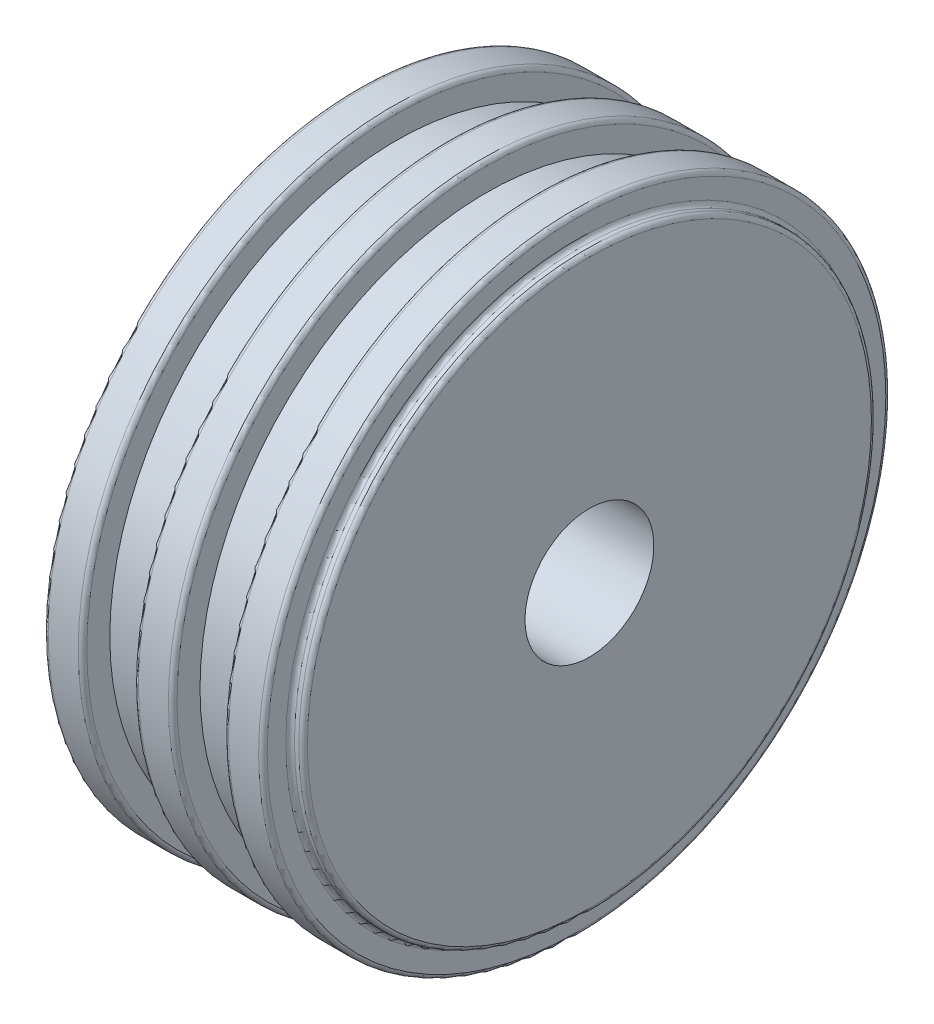
ISO-10303-21;
HEADER;
FILE_DESCRIPTION(('STEP AP214'),'2;1');
FILE_NAME('part.step','',(''),(''),'','','');
FILE_SCHEMA(('AUTOMOTIVE_DESIGN { 1 0 10303 214 1 1 1 1 }'));
ENDSEC;
DATA;
#1=APPLICATION_CONTEXT('core data for automotive mechanical design processes');
#2=APPLICATION_PROTOCOL_DEFINITION('international standard','automotive_design',2000,#1);
#3=PRODUCT_CONTEXT('',#1,'mechanical');
#4=PRODUCT('Part','Part','',(#3));
#5=PRODUCT_RELATED_PRODUCT_CATEGORY('part','',(#4));
#6=PRODUCT_DEFINITION_FORMATION('','',#4);
#7=PRODUCT_DEFINITION_CONTEXT('part definition',#1,'design');
#8=PRODUCT_DEFINITION('design','',#6,#7);
#9=PRODUCT_DEFINITION_SHAPE('','',#8);
#10=(LENGTH_UNIT() NAMED_UNIT(*) SI_UNIT(.MILLI.,.METRE.));
#11=(NAMED_UNIT(*) PLANE_ANGLE_UNIT() SI_UNIT($,.RADIAN.));
#12=(NAMED_UNIT(*) SI_UNIT($,.STERADIAN.) SOLID_ANGLE_UNIT());
#13=UNCERTAINTY_MEASURE_WITH_UNIT(LENGTH_MEASURE(1.E-05),#10,'distance_accuracy_value','');
#14=(GEOMETRIC_REPRESENTATION_CONTEXT(3) GLOBAL_UNCERTAINTY_ASSIGNED_CONTEXT((#13)) GLOBAL_UNIT_ASSIGNED_CONTEXT((#10,
#11,#12)) REPRESENTATION_CONTEXT('',''));
#15=CARTESIAN_POINT('',(0.,0.,0.));
#16=DIRECTION('',(0.,0.,1.));
#17=DIRECTION('',(1.,0.,0.));
#18=AXIS2_PLACEMENT_3D('',#15,#16,#17);
#19=CARTESIAN_POINT('',(0.,66.675,0.));
#20=DIRECTION('',(-1.,0.,0.));
#21=DIRECTION('',(0.,0.,1.));
#22=AXIS2_PLACEMENT_3D('',#19,#20,#21);
#23=PLANE('',#22);
#24=CARTESIAN_POINT('',(0.,0.,0.));
#25=DIRECTION('',(-1.,0.,0.));
#26=DIRECTION('',(0.,0.,1.));
#27=AXIS2_PLACEMENT_3D('',#24,#25,#26);
#28=CIRCLE('',#27,65.675);
#29=CARTESIAN_POINT('',(0.,0.,65.675));
#30=VERTEX_POINT('',#29);
#31=EDGE_CURVE('E50',#30,#30,#28,.F.);
#32=ORIENTED_EDGE('',*,*,#31,.T.);
#33=EDGE_LOOP('',(#32));
#34=FACE_BOUND('',#33,.T.);
#35=CARTESIAN_POINT('',(0.,0.,0.));
#36=DIRECTION('',(-1.,0.,0.));
#37=DIRECTION('',(0.,0.,1.));
#38=AXIS2_PLACEMENT_3D('',#35,#36,#37);
#39=CIRCLE('',#38,15.);
#40=CARTESIAN_POINT('',(0.,0.,15.));
#41=VERTEX_POINT('',#40);
#42=EDGE_CURVE('E118',#41,#41,#39,.T.);
#43=ORIENTED_EDGE('',*,*,#42,.T.);
#44=EDGE_LOOP('',(#43));
#45=FACE_BOUND('',#44,.T.);
#46=ADVANCED_FACE('F35',(#34,#45),#23,.F.);
#47=CARTESIAN_POINT('',(0.,0.,0.));
#48=DIRECTION('',(-1.,0.,0.));
#49=DIRECTION('',(0.,0.,1.));
#50=AXIS2_PLACEMENT_3D('',#47,#48,#49);
#51=CYLINDRICAL_SURFACE('',#50,66.675);
#52=CARTESIAN_POINT('',(-1.,0.,0.));
#53=DIRECTION('',(-1.,0.,0.));
#54=DIRECTION('',(0.,0.,1.));
#55=AXIS2_PLACEMENT_3D('',#52,#53,#54);
#56=CIRCLE('',#55,66.675);
#57=CARTESIAN_POINT('',(-1.,0.,66.675));
#58=VERTEX_POINT('',#57);
#59=EDGE_CURVE('E55',#58,#58,#56,.T.);
#60=ORIENTED_EDGE('',*,*,#59,.T.);
#61=EDGE_LOOP('',(#60));
#62=FACE_BOUND('',#61,.T.);
#63=CARTESIAN_POINT('',(-2.00000000000001,0.,0.));
#64=DIRECTION('',(-1.,0.,0.));
#65=DIRECTION('',(0.,0.,1.));
#66=AXIS2_PLACEMENT_3D('',#63,#64,#65);
#67=CIRCLE('',#66,66.675);
#68=CARTESIAN_POINT('',(-2.00000000000001,0.,66.675));
#69=VERTEX_POINT('',#68);
#70=EDGE_CURVE('E58',#69,#69,#67,.F.);
#71=ORIENTED_EDGE('',*,*,#70,.T.);
#72=EDGE_LOOP('',(#71));
#73=FACE_BOUND('',#72,.T.);
#74=ADVANCED_FACE('F140',(#62,#73),#51,.T.);
#75=CARTESIAN_POINT('',(-3.00000000000001,73.025,0.));
#76=DIRECTION('',(-1.,0.,0.));
#77=DIRECTION('',(0.,0.,1.));
#78=AXIS2_PLACEMENT_3D('',#75,#76,#77);
#79=PLANE('',#78);
#80=CARTESIAN_POINT('',(-3.00000000000001,0.,0.));
#81=DIRECTION('',(-1.,0.,0.));
#82=DIRECTION('',(0.,0.,1.));
#83=AXIS2_PLACEMENT_3D('',#80,#81,#82);
#84=CIRCLE('',#83,72.025);
#85=CARTESIAN_POINT('',(-3.00000000000001,0.,72.025));
#86=VERTEX_POINT('',#85);
#87=EDGE_CURVE('E91',#86,#86,#84,.F.);
#88=ORIENTED_EDGE('',*,*,#87,.T.);
#89=EDGE_LOOP('',(#88));
#90=FACE_BOUND('',#89,.T.);
#91=CARTESIAN_POINT('',(-3.00000000000001,0.,0.));
#92=DIRECTION('',(-1.,0.,0.));
#93=DIRECTION('',(0.,0.,1.));
#94=AXIS2_PLACEMENT_3D('',#91,#92,#93);
#95=CIRCLE('',#94,67.675);
#96=CARTESIAN_POINT('',(-3.00000000000001,0.,67.675));
#97=VERTEX_POINT('',#96);
#98=EDGE_CURVE('E94',#97,#97,#95,.T.);
#99=ORIENTED_EDGE('',*,*,#98,.T.);
#100=EDGE_LOOP('',(#99));
#101=FACE_BOUND('',#100,.T.);
#102=ADVANCED_FACE('F146',(#90,#101),#79,.F.);
#103=CARTESIAN_POINT('',(0.,0.,0.));
#104=DIRECTION('',(-1.,0.,0.));
#105=DIRECTION('',(0.,0.,1.));
#106=AXIS2_PLACEMENT_3D('',#103,#104,#105);
#107=CYLINDRICAL_SURFACE('',#106,73.025);
#108=CARTESIAN_POINT('',(-4.00000000000001,0.,0.));
#109=DIRECTION('',(-1.,0.,0.));
#110=DIRECTION('',(0.,0.,1.));
#111=AXIS2_PLACEMENT_3D('',#108,#109,#110);
#112=CIRCLE('',#111,73.025);
#113=CARTESIAN_POINT('',(-4.00000000000001,0.,73.025));
#114=VERTEX_POINT('',#113);
#115=EDGE_CURVE('E97',#114,#114,#112,.T.);
#116=ORIENTED_EDGE('',*,*,#115,.T.);
#117=EDGE_LOOP('',(#116));
#118=FACE_BOUND('',#117,.T.);
#119=CARTESIAN_POINT('',(-11.,0.,0.));
#120=DIRECTION('',(1.,0.,0.));
#121=DIRECTION('',(0.,0.,-1.));
#122=AXIS2_PLACEMENT_3D('',#119,#120,#121);
#123=CIRCLE('',#122,73.025);
#124=CARTESIAN_POINT('',(-11.,0.,-73.025));
#125=VERTEX_POINT('',#124);
#126=EDGE_CURVE('E100',#125,#125,#123,.T.);
#127=ORIENTED_EDGE('',*,*,#126,.T.);
#128=EDGE_LOOP('',(#127));
#129=FACE_BOUND('',#128,.T.);
#130=ADVANCED_FACE('F228',(#118,#129),#107,.T.);
#131=CARTESIAN_POINT('',(-12.,73.025,0.));
#132=DIRECTION('',(1.,0.,0.));
#133=DIRECTION('',(0.,0.,-1.));
#134=AXIS2_PLACEMENT_3D('',#131,#132,#133);
#135=PLANE('',#134);
#136=CARTESIAN_POINT('',(-12.,0.,0.));
#137=DIRECTION('',(1.,0.,0.));
#138=DIRECTION('',(0.,0.,-1.));
#139=AXIS2_PLACEMENT_3D('',#136,#137,#138);
#140=CIRCLE('',#139,72.025);
#141=CARTESIAN_POINT('',(-12.,0.,-72.025));
#142=VERTEX_POINT('',#141);
#143=EDGE_CURVE('E88',#142,#142,#140,.F.);
#144=ORIENTED_EDGE('',*,*,#143,.T.);
#145=EDGE_LOOP('',(#144));
#146=FACE_BOUND('',#145,.T.);
#147=CARTESIAN_POINT('',(-12.,0.,0.));
#148=DIRECTION('',(-1.,0.,0.));
#149=DIRECTION('',(0.,0.,1.));
#150=AXIS2_PLACEMENT_3D('',#147,#148,#149);
#151=CIRCLE('',#150,66.675);
#152=CARTESIAN_POINT('',(-12.,0.,66.675));
#153=VERTEX_POINT('',#152);
#154=EDGE_CURVE('E103',#153,#153,#151,.T.);
#155=ORIENTED_EDGE('',*,*,#154,.F.);
#156=EDGE_LOOP('',(#155));
#157=FACE_BOUND('',#156,.T.);
#158=ADVANCED_FACE('F224',(#146,#157),#135,.F.);
#159=CARTESIAN_POINT('',(0.,0.,0.));
#160=DIRECTION('',(-1.,0.,0.));
#161=DIRECTION('',(0.,0.,1.));
#162=AXIS2_PLACEMENT_3D('',#159,#160,#161);
#163=CYLINDRICAL_SURFACE('',#162,66.675);
#164=CARTESIAN_POINT('',(-24.,0.,0.));
#165=DIRECTION('',(-1.,0.,0.));
#166=DIRECTION('',(0.,0.,1.));
#167=AXIS2_PLACEMENT_3D('',#164,#165,#166);
#168=CIRCLE('',#167,66.675);
#169=CARTESIAN_POINT('',(-24.,0.,66.675));
#170=VERTEX_POINT('',#169);
#171=EDGE_CURVE('E106',#170,#170,#168,.T.);
#172=ORIENTED_EDGE('',*,*,#171,.F.);
#173=EDGE_LOOP('',(#172));
#174=FACE_BOUND('',#173,.T.);
#175=ORIENTED_EDGE('',*,*,#154,.T.);
#176=EDGE_LOOP('',(#175));
#177=FACE_BOUND('',#176,.T.);
#178=ADVANCED_FACE('F220',(#174,#177),#163,.T.);
#179=CARTESIAN_POINT('',(-24.,66.675,0.));
#180=DIRECTION('',(-1.,0.,0.));
#181=DIRECTION('',(0.,0.,1.));
#182=AXIS2_PLACEMENT_3D('',#179,#180,#181);
#183=PLANE('',#182);
#184=CARTESIAN_POINT('',(-24.,0.,0.));
#185=DIRECTION('',(-1.,0.,0.));
#186=DIRECTION('',(0.,0.,1.));
#187=AXIS2_PLACEMENT_3D('',#184,#185,#186);
#188=CIRCLE('',#187,72.025);
#189=CARTESIAN_POINT('',(-24.,0.,72.025));
#190=VERTEX_POINT('',#189);
#191=EDGE_CURVE('E79',#190,#190,#188,.F.);
#192=ORIENTED_EDGE('',*,*,#191,.T.);
#193=EDGE_LOOP('',(#192));
#194=FACE_BOUND('',#193,.T.);
#195=ORIENTED_EDGE('',*,*,#171,.T.);
#196=EDGE_LOOP('',(#195));
#197=FACE_BOUND('',#196,.T.);
#198=ADVANCED_FACE('F216',(#194,#197),#183,.F.);
#199=CARTESIAN_POINT('',(0.,0.,0.));
#200=DIRECTION('',(-1.,0.,0.));
#201=DIRECTION('',(0.,0.,1.));
#202=AXIS2_PLACEMENT_3D('',#199,#200,#201);
#203=CYLINDRICAL_SURFACE('',#202,73.025);
#204=CARTESIAN_POINT('',(-25.,0.,0.));
#205=DIRECTION('',(-1.,0.,0.));
#206=DIRECTION('',(0.,0.,1.));
#207=AXIS2_PLACEMENT_3D('',#204,#205,#206);
#208=CIRCLE('',#207,73.025);
#209=CARTESIAN_POINT('',(-25.,0.,73.025));
#210=VERTEX_POINT('',#209);
#211=EDGE_CURVE('E82',#210,#210,#208,.T.);
#212=ORIENTED_EDGE('',*,*,#211,.T.);
#213=EDGE_LOOP('',(#212));
#214=FACE_BOUND('',#213,.T.);
#215=CARTESIAN_POINT('',(-32.,0.,0.));
#216=DIRECTION('',(1.,0.,0.));
#217=DIRECTION('',(0.,0.,-1.));
#218=AXIS2_PLACEMENT_3D('',#215,#216,#217);
#219=CIRCLE('',#218,73.025);
#220=CARTESIAN_POINT('',(-32.,0.,-73.025));
#221=VERTEX_POINT('',#220);
#222=EDGE_CURVE('E85',#221,#221,#219,.T.);
#223=ORIENTED_EDGE('',*,*,#222,.T.);
#224=EDGE_LOOP('',(#223));
#225=FACE_BOUND('',#224,.T.);
#226=ADVANCED_FACE('F212',(#214,#225),#203,.T.);
#227=CARTESIAN_POINT('',(-33.,73.025,0.));
#228=DIRECTION('',(1.,0.,0.));
#229=DIRECTION('',(0.,0.,-1.));
#230=AXIS2_PLACEMENT_3D('',#227,#228,#229);
#231=PLANE('',#230);
#232=CARTESIAN_POINT('',(-33.,0.,0.));
#233=DIRECTION('',(1.,0.,0.));
#234=DIRECTION('',(0.,0.,-1.));
#235=AXIS2_PLACEMENT_3D('',#232,#233,#234);
#236=CIRCLE('',#235,72.025);
#237=CARTESIAN_POINT('',(-33.,0.,-72.025));
#238=VERTEX_POINT('',#237);
#239=EDGE_CURVE('E76',#238,#238,#236,.F.);
#240=ORIENTED_EDGE('',*,*,#239,.T.);
#241=EDGE_LOOP('',(#240));
#242=FACE_BOUND('',#241,.T.);
#243=CARTESIAN_POINT('',(-33.,0.,0.));
#244=DIRECTION('',(-1.,0.,0.));
#245=DIRECTION('',(0.,0.,1.));
#246=AXIS2_PLACEMENT_3D('',#243,#244,#245);
#247=CIRCLE('',#246,66.675);
#248=CARTESIAN_POINT('',(-33.,0.,66.675));
#249=VERTEX_POINT('',#248);
#250=EDGE_CURVE('E109',#249,#249,#247,.T.);
#251=ORIENTED_EDGE('',*,*,#250,.F.);
#252=EDGE_LOOP('',(#251));
#253=FACE_BOUND('',#252,.T.);
#254=ADVANCED_FACE('F208',(#242,#253),#231,.F.);
#255=CARTESIAN_POINT('',(0.,0.,0.));
#256=DIRECTION('',(-1.,0.,0.));
#257=DIRECTION('',(0.,0.,1.));
#258=AXIS2_PLACEMENT_3D('',#255,#256,#257);
#259=CYLINDRICAL_SURFACE('',#258,66.675);
#260=CARTESIAN_POINT('',(-45.,0.,0.));
#261=DIRECTION('',(-1.,0.,0.));
#262=DIRECTION('',(0.,0.,1.));
#263=AXIS2_PLACEMENT_3D('',#260,#261,#262);
#264=CIRCLE('',#263,66.675);
#265=CARTESIAN_POINT('',(-45.,0.,66.675));
#266=VERTEX_POINT('',#265);
#267=EDGE_CURVE('E112',#266,#266,#264,.T.);
#268=ORIENTED_EDGE('',*,*,#267,.F.);
#269=EDGE_LOOP('',(#268));
#270=FACE_BOUND('',#269,.T.);
#271=ORIENTED_EDGE('',*,*,#250,.T.);
#272=EDGE_LOOP('',(#271));
#273=FACE_BOUND('',#272,.T.);
#274=ADVANCED_FACE('F204',(#270,#273),#259,.T.);
#275=CARTESIAN_POINT('',(-45.,66.675,0.));
#276=DIRECTION('',(-1.,0.,0.));
#277=DIRECTION('',(0.,0.,1.));
#278=AXIS2_PLACEMENT_3D('',#275,#276,#277);
#279=PLANE('',#278);
#280=CARTESIAN_POINT('',(-45.,0.,0.));
#281=DIRECTION('',(-1.,0.,0.));
#282=DIRECTION('',(0.,0.,1.));
#283=AXIS2_PLACEMENT_3D('',#280,#281,#282);
#284=CIRCLE('',#283,72.025);
#285=CARTESIAN_POINT('',(-45.,0.,72.025));
#286=VERTEX_POINT('',#285);
#287=EDGE_CURVE('E67',#286,#286,#284,.F.);
#288=ORIENTED_EDGE('',*,*,#287,.T.);
#289=EDGE_LOOP('',(#288));
#290=FACE_BOUND('',#289,.T.);
#291=ORIENTED_EDGE('',*,*,#267,.T.);
#292=EDGE_LOOP('',(#291));
#293=FACE_BOUND('',#292,.T.);
#294=ADVANCED_FACE('F198',(#290,#293),#279,.F.);
#295=CARTESIAN_POINT('',(0.,0.,0.));
#296=DIRECTION('',(-1.,0.,0.));
#297=DIRECTION('',(0.,0.,1.));
#298=AXIS2_PLACEMENT_3D('',#295,#296,#297);
#299=CYLINDRICAL_SURFACE('',#298,73.025);
#300=CARTESIAN_POINT('',(-46.,0.,0.));
#301=DIRECTION('',(-1.,0.,0.));
#302=DIRECTION('',(0.,0.,1.));
#303=AXIS2_PLACEMENT_3D('',#300,#301,#302);
#304=CIRCLE('',#303,73.025);
#305=CARTESIAN_POINT('',(-46.,0.,73.025));
#306=VERTEX_POINT('',#305);
#307=EDGE_CURVE('E70',#306,#306,#304,.T.);
#308=ORIENTED_EDGE('',*,*,#307,.T.);
#309=EDGE_LOOP('',(#308));
#310=FACE_BOUND('',#309,.T.);
#311=CARTESIAN_POINT('',(-53.,0.,0.));
#312=DIRECTION('',(1.,0.,0.));
#313=DIRECTION('',(0.,0.,-1.));
#314=AXIS2_PLACEMENT_3D('',#311,#312,#313);
#315=CIRCLE('',#314,73.025);
#316=CARTESIAN_POINT('',(-53.,0.,-73.025));
#317=VERTEX_POINT('',#316);
#318=EDGE_CURVE('E73',#317,#317,#315,.T.);
#319=ORIENTED_EDGE('',*,*,#318,.T.);
#320=EDGE_LOOP('',(#319));
#321=FACE_BOUND('',#320,.T.);
#322=ADVANCED_FACE('F192',(#310,#321),#299,.T.);
#323=CARTESIAN_POINT('',(-54.,73.025,0.));
#324=DIRECTION('',(1.,0.,0.));
#325=DIRECTION('',(0.,0.,-1.));
#326=AXIS2_PLACEMENT_3D('',#323,#324,#325);
#327=PLANE('',#326);
#328=CARTESIAN_POINT('',(-54.,0.,0.));
#329=DIRECTION('',(1.,0.,0.));
#330=DIRECTION('',(0.,0.,-1.));
#331=AXIS2_PLACEMENT_3D('',#328,#329,#330);
#332=CIRCLE('',#331,72.025);
#333=CARTESIAN_POINT('',(-54.,0.,-72.025));
#334=VERTEX_POINT('',#333);
#335=EDGE_CURVE('E61',#334,#334,#332,.F.);
#336=ORIENTED_EDGE('',*,*,#335,.T.);
#337=EDGE_LOOP('',(#336));
#338=FACE_BOUND('',#337,.T.);
#339=CARTESIAN_POINT('',(-54.,0.,0.));
#340=DIRECTION('',(1.,0.,0.));
#341=DIRECTION('',(0.,0.,-1.));
#342=AXIS2_PLACEMENT_3D('',#339,#340,#341);
#343=CIRCLE('',#342,67.675);
#344=CARTESIAN_POINT('',(-54.,0.,-67.675));
#345=VERTEX_POINT('',#344);
#346=EDGE_CURVE('E64',#345,#345,#343,.T.);
#347=ORIENTED_EDGE('',*,*,#346,.T.);
#348=EDGE_LOOP('',(#347));
#349=FACE_BOUND('',#348,.T.);
#350=ADVANCED_FACE('F137',(#338,#349),#327,.F.);
#351=CARTESIAN_POINT('',(0.,0.,0.));
#352=DIRECTION('',(-1.,0.,0.));
#353=DIRECTION('',(0.,0.,1.));
#354=AXIS2_PLACEMENT_3D('',#351,#352,#353);
#355=CYLINDRICAL_SURFACE('',#354,66.675);
#356=CARTESIAN_POINT('',(-55.,0.,0.));
#357=DIRECTION('',(1.,0.,0.));
#358=DIRECTION('',(0.,0.,-1.));
#359=AXIS2_PLACEMENT_3D('',#356,#357,#358);
#360=CIRCLE('',#359,66.675);
#361=CARTESIAN_POINT('',(-55.,0.,-66.675));
#362=VERTEX_POINT('',#361);
#363=EDGE_CURVE('E42',#362,#362,#360,.F.);
#364=ORIENTED_EDGE('',*,*,#363,.T.);
#365=EDGE_LOOP('',(#364));
#366=FACE_BOUND('',#365,.T.);
#367=CARTESIAN_POINT('',(-56.,0.,0.));
#368=DIRECTION('',(1.,0.,0.));
#369=DIRECTION('',(0.,0.,-1.));
#370=AXIS2_PLACEMENT_3D('',#367,#368,#369);
#371=CIRCLE('',#370,66.675);
#372=CARTESIAN_POINT('',(-56.,0.,-66.675));
#373=VERTEX_POINT('',#372);
#374=EDGE_CURVE('E46',#373,#373,#371,.T.);
#375=ORIENTED_EDGE('',*,*,#374,.T.);
#376=EDGE_LOOP('',(#375));
#377=FACE_BOUND('',#376,.T.);
#378=ADVANCED_FACE('F132',(#366,#377),#355,.T.);
#379=CARTESIAN_POINT('',(-57.,66.675,0.));
#380=DIRECTION('',(1.,0.,0.));
#381=DIRECTION('',(0.,0.,-1.));
#382=AXIS2_PLACEMENT_3D('',#379,#380,#381);
#383=PLANE('',#382);
#384=CARTESIAN_POINT('',(-57.,0.,0.));
#385=DIRECTION('',(1.,0.,0.));
#386=DIRECTION('',(0.,0.,-1.));
#387=AXIS2_PLACEMENT_3D('',#384,#385,#386);
#388=CIRCLE('',#387,65.675);
#389=CARTESIAN_POINT('',(-57.,0.,-65.675));
#390=VERTEX_POINT('',#389);
#391=EDGE_CURVE('E10',#390,#390,#388,.F.);
#392=ORIENTED_EDGE('',*,*,#391,.T.);
#393=EDGE_LOOP('',(#392));
#394=FACE_BOUND('',#393,.T.);
#395=CARTESIAN_POINT('',(-57.,0.,0.));
#396=DIRECTION('',(-1.,0.,0.));
#397=DIRECTION('',(0.,0.,1.));
#398=AXIS2_PLACEMENT_3D('',#395,#396,#397);
#399=CIRCLE('',#398,15.);
#400=CARTESIAN_POINT('',(-57.,0.,15.));
#401=VERTEX_POINT('',#400);
#402=EDGE_CURVE('E115',#401,#401,#399,.T.);
#403=ORIENTED_EDGE('',*,*,#402,.F.);
#404=EDGE_LOOP('',(#403));
#405=FACE_BOUND('',#404,.T.);
#406=ADVANCED_FACE('F127',(#394,#405),#383,.F.);
#407=CARTESIAN_POINT('',(0.,0.,0.));
#408=DIRECTION('',(-1.,0.,0.));
#409=DIRECTION('',(0.,0.,1.));
#410=AXIS2_PLACEMENT_3D('',#407,#408,#409);
#411=CYLINDRICAL_SURFACE('',#410,15.);
#412=ORIENTED_EDGE('',*,*,#42,.F.);
#413=EDGE_LOOP('',(#412));
#414=FACE_BOUND('',#413,.T.);
#415=ORIENTED_EDGE('',*,*,#402,.T.);
#416=EDGE_LOOP('',(#415));
#417=FACE_BOUND('',#416,.T.);
#418=ADVANCED_FACE('F123',(#414,#417),#411,.F.);
#419=CARTESIAN_POINT('',(-4.00000000000001,0.,0.));
#420=DIRECTION('',(-1.,0.,0.));
#421=DIRECTION('',(0.,0.,1.));
#422=AXIS2_PLACEMENT_3D('',#419,#420,#421);
#423=TOROIDAL_SURFACE('',#422,72.025,1.);
#424=ORIENTED_EDGE('',*,*,#87,.F.);
#425=EDGE_LOOP('',(#424));
#426=FACE_BOUND('',#425,.T.);
#427=ORIENTED_EDGE('',*,*,#115,.F.);
#428=EDGE_LOOP('',(#427));
#429=FACE_BOUND('',#428,.T.);
#430=ADVANCED_FACE('F126',(#426,#429),#423,.T.);
#431=CARTESIAN_POINT('',(-11.,0.,0.));
#432=DIRECTION('',(1.,0.,0.));
#433=DIRECTION('',(0.,0.,-1.));
#434=AXIS2_PLACEMENT_3D('',#431,#432,#433);
#435=TOROIDAL_SURFACE('',#434,72.025,1.);
#436=ORIENTED_EDGE('',*,*,#126,.F.);
#437=EDGE_LOOP('',(#436));
#438=FACE_BOUND('',#437,.T.);
#439=ORIENTED_EDGE('',*,*,#143,.F.);
#440=EDGE_LOOP('',(#439));
#441=FACE_BOUND('',#440,.T.);
#442=ADVANCED_FACE('F153',(#438,#441),#435,.T.);
#443=CARTESIAN_POINT('',(-25.,0.,0.));
#444=DIRECTION('',(-1.,0.,0.));
#445=DIRECTION('',(0.,0.,1.));
#446=AXIS2_PLACEMENT_3D('',#443,#444,#445);
#447=TOROIDAL_SURFACE('',#446,72.025,1.);
#448=ORIENTED_EDGE('',*,*,#191,.F.);
#449=EDGE_LOOP('',(#448));
#450=FACE_BOUND('',#449,.T.);
#451=ORIENTED_EDGE('',*,*,#211,.F.);
#452=EDGE_LOOP('',(#451));
#453=FACE_BOUND('',#452,.T.);
#454=ADVANCED_FACE('F157',(#450,#453),#447,.T.);
#455=CARTESIAN_POINT('',(-32.,0.,0.));
#456=DIRECTION('',(1.,0.,0.));
#457=DIRECTION('',(0.,0.,-1.));
#458=AXIS2_PLACEMENT_3D('',#455,#456,#457);
#459=TOROIDAL_SURFACE('',#458,72.025,1.);
#460=ORIENTED_EDGE('',*,*,#222,.F.);
#461=EDGE_LOOP('',(#460));
#462=FACE_BOUND('',#461,.T.);
#463=ORIENTED_EDGE('',*,*,#239,.F.);
#464=EDGE_LOOP('',(#463));
#465=FACE_BOUND('',#464,.T.);
#466=ADVANCED_FACE('F161',(#462,#465),#459,.T.);
#467=CARTESIAN_POINT('',(-46.,0.,0.));
#468=DIRECTION('',(-1.,0.,0.));
#469=DIRECTION('',(0.,0.,1.));
#470=AXIS2_PLACEMENT_3D('',#467,#468,#469);
#471=TOROIDAL_SURFACE('',#470,72.025,1.);
#472=ORIENTED_EDGE('',*,*,#287,.F.);
#473=EDGE_LOOP('',(#472));
#474=FACE_BOUND('',#473,.T.);
#475=ORIENTED_EDGE('',*,*,#307,.F.);
#476=EDGE_LOOP('',(#475));
#477=FACE_BOUND('',#476,.T.);
#478=ADVANCED_FACE('F165',(#474,#477),#471,.T.);
#479=CARTESIAN_POINT('',(-53.,0.,0.));
#480=DIRECTION('',(1.,0.,0.));
#481=DIRECTION('',(0.,0.,-1.));
#482=AXIS2_PLACEMENT_3D('',#479,#480,#481);
#483=TOROIDAL_SURFACE('',#482,72.025,1.);
#484=ORIENTED_EDGE('',*,*,#318,.F.);
#485=EDGE_LOOP('',(#484));
#486=FACE_BOUND('',#485,.T.);
#487=ORIENTED_EDGE('',*,*,#335,.F.);
#488=EDGE_LOOP('',(#487));
#489=FACE_BOUND('',#488,.T.);
#490=ADVANCED_FACE('F169',(#486,#489),#483,.T.);
#491=CARTESIAN_POINT('',(-1.,0.,0.));
#492=DIRECTION('',(-1.,0.,0.));
#493=DIRECTION('',(0.,0.,1.));
#494=AXIS2_PLACEMENT_3D('',#491,#492,#493);
#495=TOROIDAL_SURFACE('',#494,65.675,1.);
#496=ORIENTED_EDGE('',*,*,#31,.F.);
#497=EDGE_LOOP('',(#496));
#498=FACE_BOUND('',#497,.T.);
#499=ORIENTED_EDGE('',*,*,#59,.F.);
#500=EDGE_LOOP('',(#499));
#501=FACE_BOUND('',#500,.T.);
#502=ADVANCED_FACE('F173',(#498,#501),#495,.T.);
#503=CARTESIAN_POINT('',(-2.00000000000001,0.,0.));
#504=DIRECTION('',(-1.,0.,0.));
#505=DIRECTION('',(0.,0.,1.));
#506=AXIS2_PLACEMENT_3D('',#503,#504,#505);
#507=TOROIDAL_SURFACE('',#506,67.675,1.);
#508=ORIENTED_EDGE('',*,*,#70,.F.);
#509=EDGE_LOOP('',(#508));
#510=FACE_BOUND('',#509,.T.);
#511=ORIENTED_EDGE('',*,*,#98,.F.);
#512=EDGE_LOOP('',(#511));
#513=FACE_BOUND('',#512,.T.);
#514=ADVANCED_FACE('F177',(#510,#513),#507,.F.);
#515=CARTESIAN_POINT('',(-55.,0.,0.));
#516=DIRECTION('',(1.,0.,0.));
#517=DIRECTION('',(0.,0.,-1.));
#518=AXIS2_PLACEMENT_3D('',#515,#516,#517);
#519=TOROIDAL_SURFACE('',#518,67.675,1.);
#520=ORIENTED_EDGE('',*,*,#346,.F.);
#521=EDGE_LOOP('',(#520));
#522=FACE_BOUND('',#521,.T.);
#523=ORIENTED_EDGE('',*,*,#363,.F.);
#524=EDGE_LOOP('',(#523));
#525=FACE_BOUND('',#524,.T.);
#526=ADVANCED_FACE('F180',(#522,#525),#519,.F.);
#527=CARTESIAN_POINT('',(-56.,0.,0.));
#528=DIRECTION('',(1.,0.,0.));
#529=DIRECTION('',(0.,0.,-1.));
#530=AXIS2_PLACEMENT_3D('',#527,#528,#529);
#531=TOROIDAL_SURFACE('',#530,65.675,1.);
#532=ORIENTED_EDGE('',*,*,#374,.F.);
#533=EDGE_LOOP('',(#532));
#534=FACE_BOUND('',#533,.T.);
#535=ORIENTED_EDGE('',*,*,#391,.F.);
#536=EDGE_LOOP('',(#535));
#537=FACE_BOUND('',#536,.T.);
#538=ADVANCED_FACE('F37',(#534,#537),#531,.T.);
#539=CLOSED_SHELL('',(#46,#74,#102,#130,#158,#178,#198,#226,#254,#274,#294,#322,#350,#378,#406,
#418,#430,#442,#454,#466,#478,#490,#502,#514,#526,#538));
#540=MANIFOLD_SOLID_BREP('B2',#539);
#541=ADVANCED_BREP_SHAPE_REPRESENTATION('',(#18,#540),#14);
#542=SHAPE_DEFINITION_REPRESENTATION(#9,#541);
ENDSEC;
END-ISO-10303-21;
